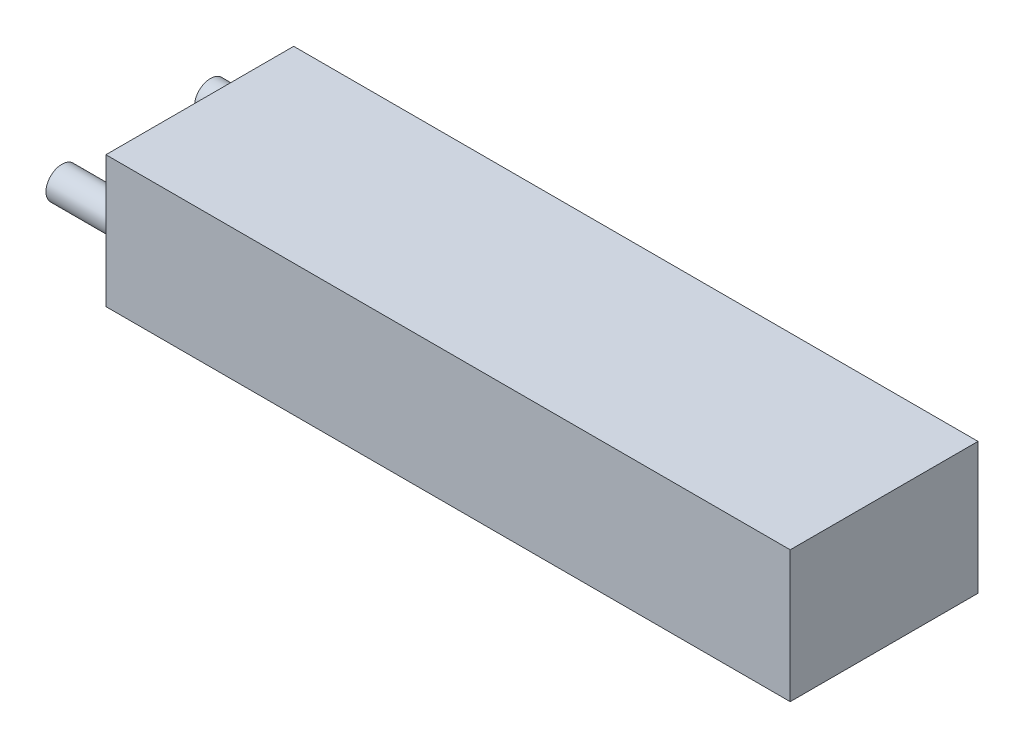
ISO-10303-21;
HEADER;
FILE_DESCRIPTION(('STEP AP214'),'2;1');
FILE_NAME('part.step','',(''),(''),'','','');
FILE_SCHEMA(('AUTOMOTIVE_DESIGN { 1 0 10303 214 1 1 1 1 }'));
ENDSEC;
DATA;
#1=APPLICATION_CONTEXT('core data for automotive mechanical design processes');
#2=APPLICATION_PROTOCOL_DEFINITION('international standard','automotive_design',2000,#1);
#3=PRODUCT_CONTEXT('',#1,'mechanical');
#4=PRODUCT('Part','Part','',(#3));
#5=PRODUCT_RELATED_PRODUCT_CATEGORY('part','',(#4));
#6=PRODUCT_DEFINITION_FORMATION('','',#4);
#7=PRODUCT_DEFINITION_CONTEXT('part definition',#1,'design');
#8=PRODUCT_DEFINITION('design','',#6,#7);
#9=PRODUCT_DEFINITION_SHAPE('','',#8);
#10=(LENGTH_UNIT() NAMED_UNIT(*) SI_UNIT(.MILLI.,.METRE.));
#11=(NAMED_UNIT(*) PLANE_ANGLE_UNIT() SI_UNIT($,.RADIAN.));
#12=(NAMED_UNIT(*) SI_UNIT($,.STERADIAN.) SOLID_ANGLE_UNIT());
#13=UNCERTAINTY_MEASURE_WITH_UNIT(LENGTH_MEASURE(1.E-05),#10,'distance_accuracy_value','');
#14=(GEOMETRIC_REPRESENTATION_CONTEXT(3) GLOBAL_UNCERTAINTY_ASSIGNED_CONTEXT((#13)) GLOBAL_UNIT_ASSIGNED_CONTEXT((#10,
#11,#12)) REPRESENTATION_CONTEXT('',''));
#15=CARTESIAN_POINT('',(0.,0.,0.));
#16=DIRECTION('',(0.,0.,1.));
#17=DIRECTION('',(1.,0.,0.));
#18=AXIS2_PLACEMENT_3D('',#15,#16,#17);
#19=CARTESIAN_POINT('',(32.25,6.2,-8.85));
#20=DIRECTION('',(-1.,0.,0.));
#21=DIRECTION('',(0.,0.,1.));
#22=AXIS2_PLACEMENT_3D('',#19,#20,#21);
#23=PLANE('',#22);
#24=DIRECTION('',(0.,0.,-1.));
#25=VECTOR('',#24,1.);
#26=CARTESIAN_POINT('',(32.25,-6.2,-8.85));
#27=LINE('',#26,#25);
#28=CARTESIAN_POINT('',(32.25,-6.2,8.85));
#29=VERTEX_POINT('',#28);
#30=CARTESIAN_POINT('',(32.25,-6.2,-8.85));
#31=VERTEX_POINT('',#30);
#32=EDGE_CURVE('E107',#29,#31,#27,.T.);
#33=ORIENTED_EDGE('',*,*,#32,.T.);
#34=DIRECTION('',(0.,-1.,0.));
#35=VECTOR('',#34,1.);
#36=CARTESIAN_POINT('',(32.25,6.2,-8.85));
#37=LINE('',#36,#35);
#38=CARTESIAN_POINT('',(32.25,6.2,-8.85));
#39=VERTEX_POINT('',#38);
#40=EDGE_CURVE('E100',#39,#31,#37,.T.);
#41=ORIENTED_EDGE('',*,*,#40,.F.);
#42=DIRECTION('',(0.,0.,-1.));
#43=VECTOR('',#42,1.);
#44=CARTESIAN_POINT('',(32.25,6.2,-8.85));
#45=LINE('',#44,#43);
#46=CARTESIAN_POINT('',(32.25,6.2,8.85));
#47=VERTEX_POINT('',#46);
#48=EDGE_CURVE('E91',#47,#39,#45,.T.);
#49=ORIENTED_EDGE('',*,*,#48,.F.);
#50=DIRECTION('',(0.,-1.,0.));
#51=VECTOR('',#50,1.);
#52=CARTESIAN_POINT('',(32.25,6.2,8.85));
#53=LINE('',#52,#51);
#54=EDGE_CURVE('E105',#47,#29,#53,.T.);
#55=ORIENTED_EDGE('',*,*,#54,.T.);
#56=EDGE_LOOP('',(#33,#41,#49,#55));
#57=FACE_BOUND('',#56,.T.);
#58=ADVANCED_FACE('F39',(#57),#23,.F.);
#59=CARTESIAN_POINT('',(-32.25,6.2,-8.85));
#60=DIRECTION('',(0.,0.,1.));
#61=DIRECTION('',(1.,0.,0.));
#62=AXIS2_PLACEMENT_3D('',#59,#60,#61);
#63=PLANE('',#62);
#64=DIRECTION('',(-1.,0.,0.));
#65=VECTOR('',#64,1.);
#66=CARTESIAN_POINT('',(-32.25,-6.2,-8.85));
#67=LINE('',#66,#65);
#68=CARTESIAN_POINT('',(-32.25,-6.2,-8.85));
#69=VERTEX_POINT('',#68);
#70=EDGE_CURVE('E96',#31,#69,#67,.T.);
#71=ORIENTED_EDGE('',*,*,#70,.T.);
#72=DIRECTION('',(0.,-1.,0.));
#73=VECTOR('',#72,1.);
#74=CARTESIAN_POINT('',(-32.25,6.2,-8.85));
#75=LINE('',#74,#73);
#76=CARTESIAN_POINT('',(-32.25,6.2,-8.85));
#77=VERTEX_POINT('',#76);
#78=EDGE_CURVE('E92',#77,#69,#75,.T.);
#79=ORIENTED_EDGE('',*,*,#78,.F.);
#80=DIRECTION('',(-1.,0.,0.));
#81=VECTOR('',#80,1.);
#82=CARTESIAN_POINT('',(-32.25,6.2,-8.85));
#83=LINE('',#82,#81);
#84=EDGE_CURVE('E86',#39,#77,#83,.T.);
#85=ORIENTED_EDGE('',*,*,#84,.F.);
#86=ORIENTED_EDGE('',*,*,#40,.T.);
#87=EDGE_LOOP('',(#71,#79,#85,#86));
#88=FACE_BOUND('',#87,.T.);
#89=ADVANCED_FACE('F94',(#88),#63,.F.);
#90=CARTESIAN_POINT('',(-32.25,6.2,-8.85));
#91=DIRECTION('',(1.,0.,0.));
#92=DIRECTION('',(0.,0.,-1.));
#93=AXIS2_PLACEMENT_3D('',#90,#91,#92);
#94=PLANE('',#93);
#95=CARTESIAN_POINT('',(-32.25,0.,-7.));
#96=DIRECTION('',(1.,0.,0.));
#97=DIRECTION('',(0.,0.,-1.));
#98=AXIS2_PLACEMENT_3D('',#95,#96,#97);
#99=CIRCLE('',#98,1.5);
#100=CARTESIAN_POINT('',(-32.25,0.,-8.5));
#101=VERTEX_POINT('',#100);
#102=EDGE_CURVE('E11',#101,#101,#99,.F.);
#103=ORIENTED_EDGE('',*,*,#102,.F.);
#104=EDGE_LOOP('',(#103));
#105=FACE_BOUND('',#104,.T.);
#106=CARTESIAN_POINT('',(-32.25,0.,7.));
#107=DIRECTION('',(1.,0.,0.));
#108=DIRECTION('',(0.,0.,-1.));
#109=AXIS2_PLACEMENT_3D('',#106,#107,#108);
#110=CIRCLE('',#109,1.5);
#111=CARTESIAN_POINT('',(-32.25,0.,5.5));
#112=VERTEX_POINT('',#111);
#113=EDGE_CURVE('E50',#112,#112,#110,.F.);
#114=ORIENTED_EDGE('',*,*,#113,.F.);
#115=EDGE_LOOP('',(#114));
#116=FACE_BOUND('',#115,.T.);
#117=DIRECTION('',(0.,0.,1.));
#118=VECTOR('',#117,1.);
#119=CARTESIAN_POINT('',(-32.25,-6.2,-8.85));
#120=LINE('',#119,#118);
#121=CARTESIAN_POINT('',(-32.25,-6.2,8.85));
#122=VERTEX_POINT('',#121);
#123=EDGE_CURVE('E75',#69,#122,#120,.T.);
#124=ORIENTED_EDGE('',*,*,#123,.T.);
#125=DIRECTION('',(0.,-1.,0.));
#126=VECTOR('',#125,1.);
#127=CARTESIAN_POINT('',(-32.25,6.2,8.85));
#128=LINE('',#127,#126);
#129=CARTESIAN_POINT('',(-32.25,6.2,8.85));
#130=VERTEX_POINT('',#129);
#131=EDGE_CURVE('E97',#130,#122,#128,.T.);
#132=ORIENTED_EDGE('',*,*,#131,.F.);
#133=DIRECTION('',(0.,0.,1.));
#134=VECTOR('',#133,1.);
#135=CARTESIAN_POINT('',(-32.25,6.2,-8.85));
#136=LINE('',#135,#134);
#137=EDGE_CURVE('E87',#77,#130,#136,.T.);
#138=ORIENTED_EDGE('',*,*,#137,.F.);
#139=ORIENTED_EDGE('',*,*,#78,.T.);
#140=EDGE_LOOP('',(#124,#132,#138,#139));
#141=FACE_BOUND('',#140,.T.);
#142=ADVANCED_FACE('F99',(#105,#116,#141),#94,.F.);
#143=CARTESIAN_POINT('',(-32.25,6.2,8.85));
#144=DIRECTION('',(0.,0.,-1.));
#145=DIRECTION('',(-1.,0.,0.));
#146=AXIS2_PLACEMENT_3D('',#143,#144,#145);
#147=PLANE('',#146);
#148=DIRECTION('',(1.,0.,0.));
#149=VECTOR('',#148,1.);
#150=CARTESIAN_POINT('',(-32.25,-6.2,8.85));
#151=LINE('',#150,#149);
#152=EDGE_CURVE('E76',#122,#29,#151,.T.);
#153=ORIENTED_EDGE('',*,*,#152,.T.);
#154=ORIENTED_EDGE('',*,*,#54,.F.);
#155=DIRECTION('',(1.,0.,0.));
#156=VECTOR('',#155,1.);
#157=CARTESIAN_POINT('',(-32.25,6.2,8.85));
#158=LINE('',#157,#156);
#159=EDGE_CURVE('E54',#130,#47,#158,.T.);
#160=ORIENTED_EDGE('',*,*,#159,.F.);
#161=ORIENTED_EDGE('',*,*,#131,.T.);
#162=EDGE_LOOP('',(#153,#154,#160,#161));
#163=FACE_BOUND('',#162,.T.);
#164=ADVANCED_FACE('F123',(#163),#147,.F.);
#165=CARTESIAN_POINT('',(0.,6.2,0.));
#166=DIRECTION('',(0.,1.,0.));
#167=DIRECTION('',(0.,0.,1.));
#168=AXIS2_PLACEMENT_3D('',#165,#166,#167);
#169=PLANE('',#168);
#170=ORIENTED_EDGE('',*,*,#48,.T.);
#171=ORIENTED_EDGE('',*,*,#84,.T.);
#172=ORIENTED_EDGE('',*,*,#137,.T.);
#173=ORIENTED_EDGE('',*,*,#159,.T.);
#174=EDGE_LOOP('',(#170,#171,#172,#173));
#175=FACE_BOUND('',#174,.T.);
#176=ADVANCED_FACE('F90',(#175),#169,.T.);
#177=CARTESIAN_POINT('',(0.,-6.2,0.));
#178=DIRECTION('',(0.,1.,0.));
#179=DIRECTION('',(0.,0.,1.));
#180=AXIS2_PLACEMENT_3D('',#177,#178,#179);
#181=PLANE('',#180);
#182=ORIENTED_EDGE('',*,*,#32,.F.);
#183=ORIENTED_EDGE('',*,*,#152,.F.);
#184=ORIENTED_EDGE('',*,*,#123,.F.);
#185=ORIENTED_EDGE('',*,*,#70,.F.);
#186=EDGE_LOOP('',(#182,#183,#184,#185));
#187=FACE_BOUND('',#186,.T.);
#188=ADVANCED_FACE('F138',(#187),#181,.F.);
#189=CARTESIAN_POINT('',(-38.25,0.,7.));
#190=DIRECTION('',(1.,0.,0.));
#191=DIRECTION('',(0.,0.,-1.));
#192=AXIS2_PLACEMENT_3D('',#189,#190,#191);
#193=CYLINDRICAL_SURFACE('',#192,1.5);
#194=CARTESIAN_POINT('',(-38.25,0.,7.));
#195=DIRECTION('',(-1.,0.,0.));
#196=DIRECTION('',(0.,0.,-1.));
#197=AXIS2_PLACEMENT_3D('',#194,#195,#196);
#198=CIRCLE('',#197,1.5);
#199=CARTESIAN_POINT('',(-38.25,0.,5.5));
#200=VERTEX_POINT('',#199);
#201=EDGE_CURVE('E165',#200,#200,#198,.T.);
#202=ORIENTED_EDGE('',*,*,#201,.F.);
#203=EDGE_LOOP('',(#202));
#204=FACE_BOUND('',#203,.T.);
#205=ORIENTED_EDGE('',*,*,#113,.T.);
#206=EDGE_LOOP('',(#205));
#207=FACE_BOUND('',#206,.T.);
#208=ADVANCED_FACE('F118',(#204,#207),#193,.T.);
#209=CARTESIAN_POINT('',(-38.25,0.,7.));
#210=DIRECTION('',(1.,0.,0.));
#211=DIRECTION('',(0.,0.,-1.));
#212=AXIS2_PLACEMENT_3D('',#209,#210,#211);
#213=PLANE('',#212);
#214=ORIENTED_EDGE('',*,*,#201,.T.);
#215=EDGE_LOOP('',(#214));
#216=FACE_BOUND('',#215,.T.);
#217=ADVANCED_FACE('F142',(#216),#213,.F.);
#218=CARTESIAN_POINT('',(-38.25,0.,-7.));
#219=DIRECTION('',(1.,0.,0.));
#220=DIRECTION('',(0.,0.,-1.));
#221=AXIS2_PLACEMENT_3D('',#218,#219,#220);
#222=CYLINDRICAL_SURFACE('',#221,1.5);
#223=CARTESIAN_POINT('',(-38.25,0.,-7.));
#224=DIRECTION('',(-1.,0.,0.));
#225=DIRECTION('',(0.,0.,1.));
#226=AXIS2_PLACEMENT_3D('',#223,#224,#225);
#227=CIRCLE('',#226,1.5);
#228=CARTESIAN_POINT('',(-38.25,0.,-5.5));
#229=VERTEX_POINT('',#228);
#230=EDGE_CURVE('E109',#229,#229,#227,.T.);
#231=ORIENTED_EDGE('',*,*,#230,.F.);
#232=EDGE_LOOP('',(#231));
#233=FACE_BOUND('',#232,.T.);
#234=ORIENTED_EDGE('',*,*,#102,.T.);
#235=EDGE_LOOP('',(#234));
#236=FACE_BOUND('',#235,.T.);
#237=ADVANCED_FACE('F146',(#233,#236),#222,.T.);
#238=CARTESIAN_POINT('',(-38.25,0.,-7.));
#239=DIRECTION('',(-1.,0.,0.));
#240=DIRECTION('',(0.,0.,1.));
#241=AXIS2_PLACEMENT_3D('',#238,#239,#240);
#242=PLANE('',#241);
#243=ORIENTED_EDGE('',*,*,#230,.T.);
#244=EDGE_LOOP('',(#243));
#245=FACE_BOUND('',#244,.T.);
#246=ADVANCED_FACE('F154',(#245),#242,.T.);
#247=CLOSED_SHELL('',(#58,#89,#142,#164,#176,#188,#208,#217,#237,#246));
#248=MANIFOLD_SOLID_BREP('B2',#247);
#249=ADVANCED_BREP_SHAPE_REPRESENTATION('',(#18,#248),#14);
#250=SHAPE_DEFINITION_REPRESENTATION(#9,#249);
ENDSEC;
END-ISO-10303-21;
